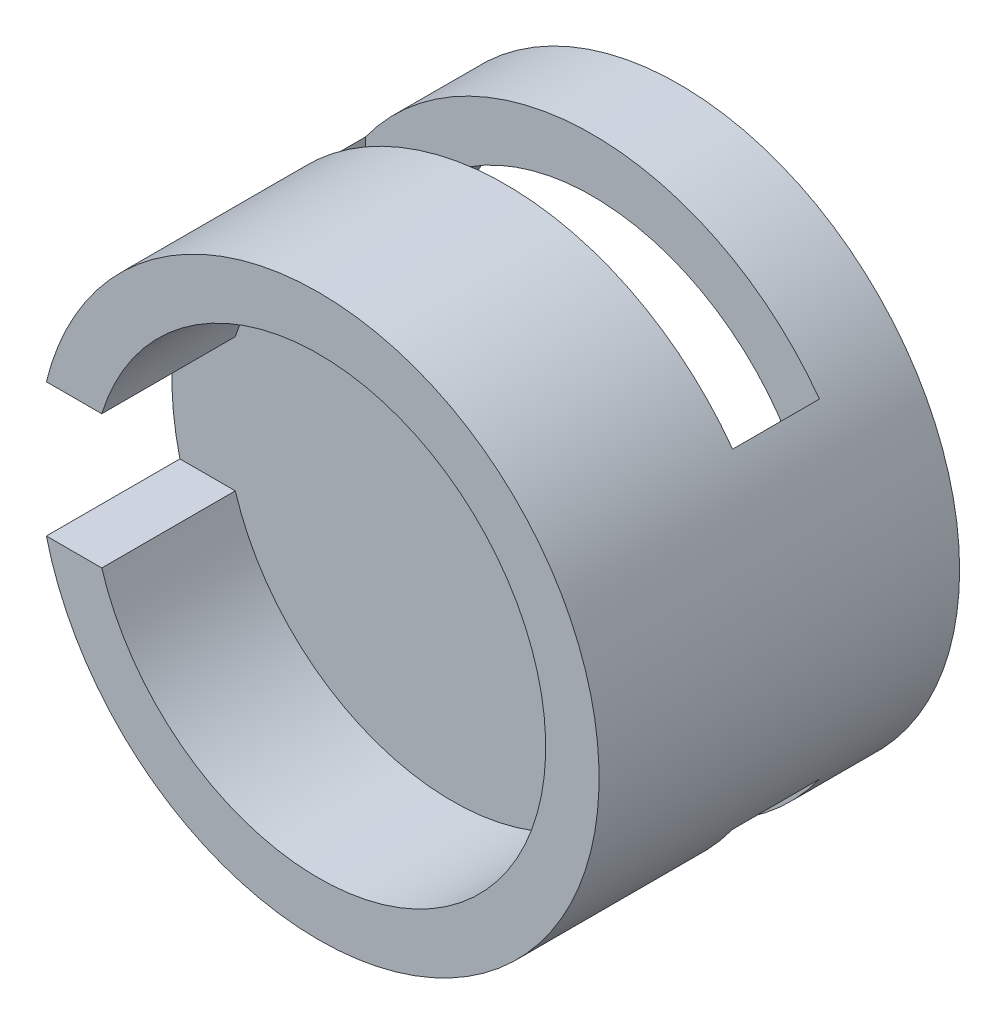
ISO-10303-21;
HEADER;
FILE_DESCRIPTION(('STEP AP214'),'2;1');
FILE_NAME('part.step','',(''),(''),'','','');
FILE_SCHEMA(('AUTOMOTIVE_DESIGN { 1 0 10303 214 1 1 1 1 }'));
ENDSEC;
DATA;
#1=APPLICATION_CONTEXT('core data for automotive mechanical design processes');
#2=APPLICATION_PROTOCOL_DEFINITION('international standard','automotive_design',2000,#1);
#3=PRODUCT_CONTEXT('',#1,'mechanical');
#4=PRODUCT('Part','Part','',(#3));
#5=PRODUCT_RELATED_PRODUCT_CATEGORY('part','',(#4));
#6=PRODUCT_DEFINITION_FORMATION('','',#4);
#7=PRODUCT_DEFINITION_CONTEXT('part definition',#1,'design');
#8=PRODUCT_DEFINITION('design','',#6,#7);
#9=PRODUCT_DEFINITION_SHAPE('','',#8);
#10=(LENGTH_UNIT() NAMED_UNIT(*) SI_UNIT(.MILLI.,.METRE.));
#11=(NAMED_UNIT(*) PLANE_ANGLE_UNIT() SI_UNIT($,.RADIAN.));
#12=(NAMED_UNIT(*) SI_UNIT($,.STERADIAN.) SOLID_ANGLE_UNIT());
#13=UNCERTAINTY_MEASURE_WITH_UNIT(LENGTH_MEASURE(1.E-05),#10,'distance_accuracy_value','');
#14=(GEOMETRIC_REPRESENTATION_CONTEXT(3) GLOBAL_UNCERTAINTY_ASSIGNED_CONTEXT((#13)) GLOBAL_UNIT_ASSIGNED_CONTEXT((#10,
#11,#12)) REPRESENTATION_CONTEXT('',''));
#15=CARTESIAN_POINT('',(0.,0.,0.));
#16=DIRECTION('',(0.,0.,1.));
#17=DIRECTION('',(1.,0.,0.));
#18=AXIS2_PLACEMENT_3D('',#15,#16,#17);
#19=CARTESIAN_POINT('',(0.,0.,10.));
#20=DIRECTION('',(0.,0.,-1.));
#21=DIRECTION('',(-1.,0.,0.));
#22=AXIS2_PLACEMENT_3D('',#19,#20,#21);
#23=CYLINDRICAL_SURFACE('',#22,21.);
#24=DIRECTION('',(0.,0.,-1.));
#25=VECTOR('',#24,1.);
#26=CARTESIAN_POINT('',(-17.,-12.328828005938,10.));
#27=LINE('',#26,#25);
#28=CARTESIAN_POINT('',(-17.,-12.328828005938,-4.));
#29=VERTEX_POINT('',#28);
#30=CARTESIAN_POINT('',(-17.,-12.328828005938,-10.5));
#31=VERTEX_POINT('',#30);
#32=EDGE_CURVE('E131',#29,#31,#27,.T.);
#33=ORIENTED_EDGE('',*,*,#32,.F.);
#34=CARTESIAN_POINT('',(0.,0.,-4.));
#35=DIRECTION('',(0.,0.,-1.));
#36=DIRECTION('',(-1.,0.,0.));
#37=AXIS2_PLACEMENT_3D('',#34,#35,#36);
#38=CIRCLE('',#37,21.);
#39=CARTESIAN_POINT('',(17.,-12.328828005938,-4.));
#40=VERTEX_POINT('',#39);
#41=EDGE_CURVE('E117',#40,#29,#38,.T.);
#42=ORIENTED_EDGE('',*,*,#41,.F.);
#43=DIRECTION('',(0.,0.,-1.));
#44=VECTOR('',#43,1.);
#45=CARTESIAN_POINT('',(17.,-12.328828005938,10.));
#46=LINE('',#45,#44);
#47=CARTESIAN_POINT('',(17.,-12.328828005938,-10.5));
#48=VERTEX_POINT('',#47);
#49=EDGE_CURVE('E125',#48,#40,#46,.F.);
#50=ORIENTED_EDGE('',*,*,#49,.F.);
#51=CARTESIAN_POINT('',(0.,0.,-10.5));
#52=DIRECTION('',(0.,0.,1.));
#53=DIRECTION('',(1.,0.,0.));
#54=AXIS2_PLACEMENT_3D('',#51,#52,#53);
#55=CIRCLE('',#54,21.);
#56=EDGE_CURVE('E137',#31,#48,#55,.T.);
#57=ORIENTED_EDGE('',*,*,#56,.F.);
#58=EDGE_LOOP('',(#33,#42,#50,#57));
#59=FACE_BOUND('',#58,.T.);
#60=DIRECTION('',(0.,0.,-1.));
#61=VECTOR('',#60,1.);
#62=CARTESIAN_POINT('',(-20.3960780543711,-5.,10.));
#63=LINE('',#62,#61);
#64=CARTESIAN_POINT('',(-20.3960780543711,-5.,10.));
#65=VERTEX_POINT('',#64);
#66=CARTESIAN_POINT('',(-20.3960780543711,-5.,0.));
#67=VERTEX_POINT('',#66);
#68=EDGE_CURVE('E156',#65,#67,#63,.T.);
#69=ORIENTED_EDGE('',*,*,#68,.T.);
#70=CARTESIAN_POINT('',(0.,0.,0.));
#71=DIRECTION('',(0.,0.,-1.));
#72=DIRECTION('',(-1.,0.,0.));
#73=AXIS2_PLACEMENT_3D('',#70,#71,#72);
#74=CIRCLE('',#73,21.);
#75=CARTESIAN_POINT('',(-20.3960780543711,5.,0.));
#76=VERTEX_POINT('',#75);
#77=EDGE_CURVE('E164',#67,#76,#74,.T.);
#78=ORIENTED_EDGE('',*,*,#77,.T.);
#79=DIRECTION('',(0.,0.,-1.));
#80=VECTOR('',#79,1.);
#81=CARTESIAN_POINT('',(-20.3960780543711,5.,10.));
#82=LINE('',#81,#80);
#83=CARTESIAN_POINT('',(-20.3960780543711,5.,10.));
#84=VERTEX_POINT('',#83);
#85=EDGE_CURVE('E161',#76,#84,#82,.F.);
#86=ORIENTED_EDGE('',*,*,#85,.T.);
#87=CARTESIAN_POINT('',(0.,0.,10.));
#88=DIRECTION('',(0.,0.,1.));
#89=DIRECTION('',(1.,0.,0.));
#90=AXIS2_PLACEMENT_3D('',#87,#88,#89);
#91=CIRCLE('',#90,21.);
#92=EDGE_CURVE('E171',#65,#84,#91,.T.);
#93=ORIENTED_EDGE('',*,*,#92,.F.);
#94=EDGE_LOOP('',(#69,#78,#86,#93));
#95=FACE_BOUND('',#94,.T.);
#96=CARTESIAN_POINT('',(0.,0.,-17.));
#97=DIRECTION('',(0.,0.,1.));
#98=DIRECTION('',(1.,0.,0.));
#99=AXIS2_PLACEMENT_3D('',#96,#97,#98);
#100=CIRCLE('',#99,21.);
#101=CARTESIAN_POINT('',(21.,0.,-17.));
#102=VERTEX_POINT('',#101);
#103=EDGE_CURVE('E141',#102,#102,#100,.T.);
#104=ORIENTED_EDGE('',*,*,#103,.T.);
#105=EDGE_LOOP('',(#104));
#106=FACE_BOUND('',#105,.T.);
#107=DIRECTION('',(0.,0.,-1.));
#108=VECTOR('',#107,1.);
#109=CARTESIAN_POINT('',(-17.,12.328828005938,10.));
#110=LINE('',#109,#108);
#111=CARTESIAN_POINT('',(-17.,12.328828005938,-10.5));
#112=VERTEX_POINT('',#111);
#113=CARTESIAN_POINT('',(-17.,12.328828005938,-4.));
#114=VERTEX_POINT('',#113);
#115=EDGE_CURVE('E129',#112,#114,#110,.F.);
#116=ORIENTED_EDGE('',*,*,#115,.F.);
#117=CARTESIAN_POINT('',(17.,12.328828005938,-10.5));
#118=VERTEX_POINT('',#117);
#119=EDGE_CURVE('E128',#118,#112,#55,.T.);
#120=ORIENTED_EDGE('',*,*,#119,.F.);
#121=DIRECTION('',(0.,0.,-1.));
#122=VECTOR('',#121,1.);
#123=CARTESIAN_POINT('',(17.,12.328828005938,10.));
#124=LINE('',#123,#122);
#125=CARTESIAN_POINT('',(17.,12.328828005938,-4.));
#126=VERTEX_POINT('',#125);
#127=EDGE_CURVE('E121',#126,#118,#124,.T.);
#128=ORIENTED_EDGE('',*,*,#127,.F.);
#129=EDGE_CURVE('E106',#114,#126,#38,.T.);
#130=ORIENTED_EDGE('',*,*,#129,.F.);
#131=EDGE_LOOP('',(#116,#120,#128,#130));
#132=FACE_BOUND('',#131,.T.);
#133=ADVANCED_FACE('F36',(#59,#95,#106,#132),#23,.T.);
#134=CARTESIAN_POINT('',(0.,0.,-17.));
#135=DIRECTION('',(0.,0.,1.));
#136=DIRECTION('',(1.,0.,0.));
#137=AXIS2_PLACEMENT_3D('',#134,#135,#136);
#138=CYLINDRICAL_SURFACE('',#137,17.);
#139=CARTESIAN_POINT('',(0.,0.,-17.));
#140=DIRECTION('',(0.,0.,1.));
#141=DIRECTION('',(1.,0.,0.));
#142=AXIS2_PLACEMENT_3D('',#139,#140,#141);
#143=CIRCLE('',#142,17.);
#144=CARTESIAN_POINT('',(17.,0.,-17.));
#145=VERTEX_POINT('',#144);
#146=EDGE_CURVE('E116',#145,#145,#143,.T.);
#147=ORIENTED_EDGE('',*,*,#146,.F.);
#148=EDGE_LOOP('',(#147));
#149=FACE_BOUND('',#148,.T.);
#150=CARTESIAN_POINT('',(0.,0.,-10.5));
#151=DIRECTION('',(0.,0.,1.));
#152=DIRECTION('',(1.,0.,0.));
#153=AXIS2_PLACEMENT_3D('',#150,#151,#152);
#154=CIRCLE('',#153,17.);
#155=CARTESIAN_POINT('',(17.,0.,-10.5));
#156=VERTEX_POINT('',#155);
#157=CARTESIAN_POINT('',(-17.,0.,-10.5));
#158=VERTEX_POINT('',#157);
#159=EDGE_CURVE('E11',#156,#158,#154,.F.);
#160=ORIENTED_EDGE('',*,*,#159,.F.);
#161=EDGE_CURVE('E39',#158,#156,#154,.F.);
#162=ORIENTED_EDGE('',*,*,#161,.F.);
#163=EDGE_LOOP('',(#160,#162));
#164=FACE_BOUND('',#163,.T.);
#165=ADVANCED_FACE('F189',(#149,#164),#138,.F.);
#166=CARTESIAN_POINT('',(0.,0.,10.));
#167=DIRECTION('',(0.,0.,1.));
#168=DIRECTION('',(1.,0.,0.));
#169=AXIS2_PLACEMENT_3D('',#166,#167,#168);
#170=PLANE('',#169);
#171=DIRECTION('',(-1.,0.,0.));
#172=VECTOR('',#171,1.);
#173=CARTESIAN_POINT('',(-28.8516319183201,5.,10.));
#174=LINE('',#173,#172);
#175=CARTESIAN_POINT('',(-16.2480768092719,5.,10.));
#176=VERTEX_POINT('',#175);
#177=EDGE_CURVE('E144',#176,#84,#174,.T.);
#178=ORIENTED_EDGE('',*,*,#177,.F.);
#179=CARTESIAN_POINT('',(0.,0.,10.));
#180=DIRECTION('',(0.,0.,1.));
#181=DIRECTION('',(1.,0.,0.));
#182=AXIS2_PLACEMENT_3D('',#179,#180,#181);
#183=CIRCLE('',#182,17.);
#184=CARTESIAN_POINT('',(-16.2480768092719,-5.,10.));
#185=VERTEX_POINT('',#184);
#186=EDGE_CURVE('E168',#185,#176,#183,.T.);
#187=ORIENTED_EDGE('',*,*,#186,.F.);
#188=DIRECTION('',(1.,0.,0.));
#189=VECTOR('',#188,1.);
#190=CARTESIAN_POINT('',(-28.8516319183201,-5.,10.));
#191=LINE('',#190,#189);
#192=EDGE_CURVE('E145',#65,#185,#191,.T.);
#193=ORIENTED_EDGE('',*,*,#192,.F.);
#194=ORIENTED_EDGE('',*,*,#92,.T.);
#195=EDGE_LOOP('',(#178,#187,#193,#194));
#196=FACE_BOUND('',#195,.T.);
#197=ADVANCED_FACE('F191',(#196),#170,.T.);
#198=CARTESIAN_POINT('',(0.,0.,10.));
#199=DIRECTION('',(0.,0.,-1.));
#200=DIRECTION('',(-1.,0.,0.));
#201=AXIS2_PLACEMENT_3D('',#198,#199,#200);
#202=CYLINDRICAL_SURFACE('',#201,17.);
#203=DIRECTION('',(0.,0.,-1.));
#204=VECTOR('',#203,1.);
#205=CARTESIAN_POINT('',(-16.2480768092719,5.,10.));
#206=LINE('',#205,#204);
#207=CARTESIAN_POINT('',(-16.2480768092719,5.,0.));
#208=VERTEX_POINT('',#207);
#209=EDGE_CURVE('E159',#208,#176,#206,.F.);
#210=ORIENTED_EDGE('',*,*,#209,.F.);
#211=CARTESIAN_POINT('',(0.,0.,0.));
#212=DIRECTION('',(0.,0.,1.));
#213=DIRECTION('',(1.,0.,0.));
#214=AXIS2_PLACEMENT_3D('',#211,#212,#213);
#215=CIRCLE('',#214,17.);
#216=CARTESIAN_POINT('',(-16.2480768092719,-5.,0.));
#217=VERTEX_POINT('',#216);
#218=EDGE_CURVE('E167',#217,#208,#215,.T.);
#219=ORIENTED_EDGE('',*,*,#218,.F.);
#220=DIRECTION('',(0.,0.,-1.));
#221=VECTOR('',#220,1.);
#222=CARTESIAN_POINT('',(-16.2480768092719,-5.,10.));
#223=LINE('',#222,#221);
#224=EDGE_CURVE('E154',#185,#217,#223,.T.);
#225=ORIENTED_EDGE('',*,*,#224,.F.);
#226=ORIENTED_EDGE('',*,*,#186,.T.);
#227=EDGE_LOOP('',(#210,#219,#225,#226));
#228=FACE_BOUND('',#227,.T.);
#229=ADVANCED_FACE('F198',(#228),#202,.F.);
#230=CARTESIAN_POINT('',(0.,0.,0.));
#231=DIRECTION('',(0.,0.,-1.));
#232=DIRECTION('',(-1.,0.,0.));
#233=AXIS2_PLACEMENT_3D('',#230,#231,#232);
#234=PLANE('',#233);
#235=DIRECTION('',(1.,0.,0.));
#236=VECTOR('',#235,1.);
#237=CARTESIAN_POINT('',(-28.8516319183201,-5.,0.));
#238=LINE('',#237,#236);
#239=EDGE_CURVE('E151',#67,#217,#238,.T.);
#240=ORIENTED_EDGE('',*,*,#239,.T.);
#241=ORIENTED_EDGE('',*,*,#218,.T.);
#242=DIRECTION('',(-1.,0.,0.));
#243=VECTOR('',#242,1.);
#244=CARTESIAN_POINT('',(-28.8516319183201,5.,0.));
#245=LINE('',#244,#243);
#246=EDGE_CURVE('E147',#208,#76,#245,.T.);
#247=ORIENTED_EDGE('',*,*,#246,.T.);
#248=ORIENTED_EDGE('',*,*,#77,.F.);
#249=EDGE_LOOP('',(#240,#241,#247,#248));
#250=FACE_BOUND('',#249,.T.);
#251=ADVANCED_FACE('F216',(#250),#234,.F.);
#252=CARTESIAN_POINT('',(-28.8516319183201,5.,-18.6169947930146));
#253=DIRECTION('',(0.,1.,0.));
#254=DIRECTION('',(0.,0.,1.));
#255=AXIS2_PLACEMENT_3D('',#252,#253,#254);
#256=PLANE('',#255);
#257=ORIENTED_EDGE('',*,*,#246,.F.);
#258=ORIENTED_EDGE('',*,*,#209,.T.);
#259=ORIENTED_EDGE('',*,*,#177,.T.);
#260=ORIENTED_EDGE('',*,*,#85,.F.);
#261=EDGE_LOOP('',(#257,#258,#259,#260));
#262=FACE_BOUND('',#261,.T.);
#263=ADVANCED_FACE('F212',(#262),#256,.F.);
#264=CARTESIAN_POINT('',(-28.8516319183201,-5.,-18.6169947930146));
#265=DIRECTION('',(0.,-1.,0.));
#266=DIRECTION('',(0.,0.,-1.));
#267=AXIS2_PLACEMENT_3D('',#264,#265,#266);
#268=PLANE('',#267);
#269=ORIENTED_EDGE('',*,*,#192,.T.);
#270=ORIENTED_EDGE('',*,*,#224,.T.);
#271=ORIENTED_EDGE('',*,*,#239,.F.);
#272=ORIENTED_EDGE('',*,*,#68,.F.);
#273=EDGE_LOOP('',(#269,#270,#271,#272));
#274=FACE_BOUND('',#273,.T.);
#275=ADVANCED_FACE('F208',(#274),#268,.F.);
#276=CARTESIAN_POINT('',(0.,0.,-17.));
#277=DIRECTION('',(0.,0.,1.));
#278=DIRECTION('',(1.,0.,0.));
#279=AXIS2_PLACEMENT_3D('',#276,#277,#278);
#280=PLANE('',#279);
#281=ORIENTED_EDGE('',*,*,#146,.T.);
#282=EDGE_LOOP('',(#281));
#283=FACE_BOUND('',#282,.T.);
#284=ORIENTED_EDGE('',*,*,#103,.F.);
#285=EDGE_LOOP('',(#284));
#286=FACE_BOUND('',#285,.T.);
#287=ADVANCED_FACE('F205',(#283,#286),#280,.F.);
#288=CARTESIAN_POINT('',(-17.,27.,-10.5));
#289=DIRECTION('',(0.,0.,1.));
#290=DIRECTION('',(1.,0.,0.));
#291=AXIS2_PLACEMENT_3D('',#288,#289,#290);
#292=PLANE('',#291);
#293=ORIENTED_EDGE('',*,*,#119,.T.);
#294=DIRECTION('',(0.,-1.,0.));
#295=VECTOR('',#294,1.);
#296=CARTESIAN_POINT('',(-17.,27.,-10.5));
#297=LINE('',#296,#295);
#298=EDGE_CURVE('E182',#112,#158,#297,.T.);
#299=ORIENTED_EDGE('',*,*,#298,.T.);
#300=ORIENTED_EDGE('',*,*,#161,.T.);
#301=DIRECTION('',(0.,-1.,0.));
#302=VECTOR('',#301,1.);
#303=CARTESIAN_POINT('',(17.,27.,-10.5));
#304=LINE('',#303,#302);
#305=EDGE_CURVE('E50',#118,#156,#304,.T.);
#306=ORIENTED_EDGE('',*,*,#305,.F.);
#307=EDGE_LOOP('',(#293,#299,#300,#306));
#308=FACE_BOUND('',#307,.T.);
#309=ADVANCED_FACE('F180',(#308),#292,.T.);
#310=ORIENTED_EDGE('',*,*,#56,.T.);
#311=EDGE_CURVE('E185',#156,#48,#304,.T.);
#312=ORIENTED_EDGE('',*,*,#311,.F.);
#313=ORIENTED_EDGE('',*,*,#159,.T.);
#314=EDGE_CURVE('E57',#158,#31,#297,.T.);
#315=ORIENTED_EDGE('',*,*,#314,.T.);
#316=EDGE_LOOP('',(#310,#312,#313,#315));
#317=FACE_BOUND('',#316,.T.);
#318=ADVANCED_FACE('F186',(#317),#292,.T.);
#319=CARTESIAN_POINT('',(-17.,27.,-4.));
#320=DIRECTION('',(1.,0.,0.));
#321=DIRECTION('',(0.,0.,-1.));
#322=AXIS2_PLACEMENT_3D('',#319,#320,#321);
#323=PLANE('',#322);
#324=ORIENTED_EDGE('',*,*,#32,.T.);
#325=ORIENTED_EDGE('',*,*,#314,.F.);
#326=ORIENTED_EDGE('',*,*,#298,.F.);
#327=ORIENTED_EDGE('',*,*,#115,.T.);
#328=DIRECTION('',(0.,-1.,0.));
#329=VECTOR('',#328,1.);
#330=CARTESIAN_POINT('',(-17.,27.,-4.));
#331=LINE('',#330,#329);
#332=EDGE_CURVE('E112',#114,#29,#331,.T.);
#333=ORIENTED_EDGE('',*,*,#332,.T.);
#334=EDGE_LOOP('',(#324,#325,#326,#327,#333));
#335=FACE_BOUND('',#334,.T.);
#336=ADVANCED_FACE('F203',(#335),#323,.T.);
#337=CARTESIAN_POINT('',(17.,27.,-4.));
#338=DIRECTION('',(-1.,0.,0.));
#339=DIRECTION('',(0.,0.,1.));
#340=AXIS2_PLACEMENT_3D('',#337,#338,#339);
#341=PLANE('',#340);
#342=ORIENTED_EDGE('',*,*,#127,.T.);
#343=ORIENTED_EDGE('',*,*,#305,.T.);
#344=ORIENTED_EDGE('',*,*,#311,.T.);
#345=ORIENTED_EDGE('',*,*,#49,.T.);
#346=DIRECTION('',(0.,-1.,0.));
#347=VECTOR('',#346,1.);
#348=CARTESIAN_POINT('',(17.,27.,-4.));
#349=LINE('',#348,#347);
#350=EDGE_CURVE('E110',#126,#40,#349,.T.);
#351=ORIENTED_EDGE('',*,*,#350,.F.);
#352=EDGE_LOOP('',(#342,#343,#344,#345,#351));
#353=FACE_BOUND('',#352,.T.);
#354=ADVANCED_FACE('F120',(#353),#341,.T.);
#355=CARTESIAN_POINT('',(0.,0.,-4.));
#356=DIRECTION('',(0.,0.,-1.));
#357=DIRECTION('',(-1.,0.,0.));
#358=AXIS2_PLACEMENT_3D('',#355,#356,#357);
#359=PLANE('',#358);
#360=ORIENTED_EDGE('',*,*,#350,.T.);
#361=ORIENTED_EDGE('',*,*,#41,.T.);
#362=ORIENTED_EDGE('',*,*,#332,.F.);
#363=ORIENTED_EDGE('',*,*,#129,.T.);
#364=EDGE_LOOP('',(#360,#361,#362,#363));
#365=FACE_BOUND('',#364,.T.);
#366=ADVANCED_FACE('F108',(#365),#359,.T.);
#367=CLOSED_SHELL('',(#133,#165,#197,#229,#251,#263,#275,#287,#309,#318,#336,#354,#366));
#368=MANIFOLD_SOLID_BREP('B2',#367);
#369=ADVANCED_BREP_SHAPE_REPRESENTATION('',(#18,#368),#14);
#370=SHAPE_DEFINITION_REPRESENTATION(#9,#369);
ENDSEC;
END-ISO-10303-21;
